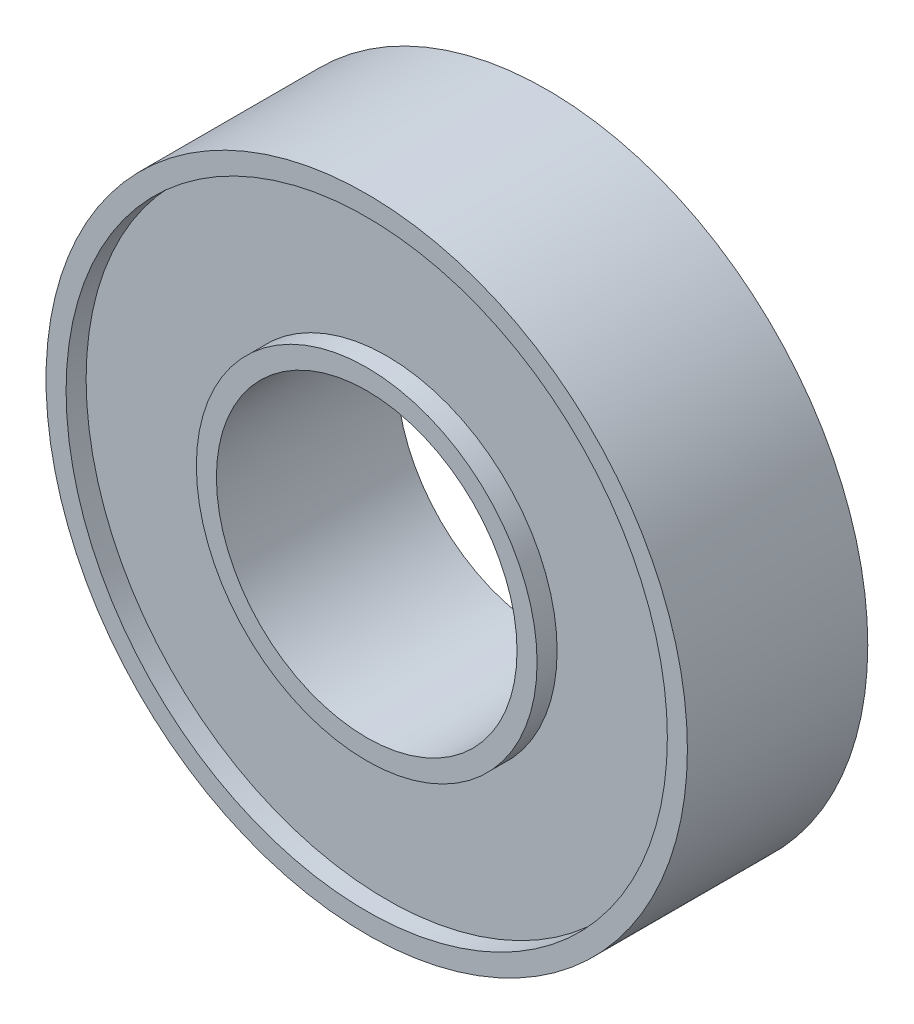
ISO-10303-21;
HEADER;
FILE_DESCRIPTION(('STEP AP214'),'2;1');
FILE_NAME('part.step','',(''),(''),'','','');
FILE_SCHEMA(('AUTOMOTIVE_DESIGN { 1 0 10303 214 1 1 1 1 }'));
ENDSEC;
DATA;
#1=APPLICATION_CONTEXT('core data for automotive mechanical design processes');
#2=APPLICATION_PROTOCOL_DEFINITION('international standard','automotive_design',2000,#1);
#3=PRODUCT_CONTEXT('',#1,'mechanical');
#4=PRODUCT('Part','Part','',(#3));
#5=PRODUCT_RELATED_PRODUCT_CATEGORY('part','',(#4));
#6=PRODUCT_DEFINITION_FORMATION('','',#4);
#7=PRODUCT_DEFINITION_CONTEXT('part definition',#1,'design');
#8=PRODUCT_DEFINITION('design','',#6,#7);
#9=PRODUCT_DEFINITION_SHAPE('','',#8);
#10=(LENGTH_UNIT() NAMED_UNIT(*) SI_UNIT(.MILLI.,.METRE.));
#11=(NAMED_UNIT(*) PLANE_ANGLE_UNIT() SI_UNIT($,.RADIAN.));
#12=(NAMED_UNIT(*) SI_UNIT($,.STERADIAN.) SOLID_ANGLE_UNIT());
#13=UNCERTAINTY_MEASURE_WITH_UNIT(LENGTH_MEASURE(1.E-05),#10,'distance_accuracy_value','');
#14=(GEOMETRIC_REPRESENTATION_CONTEXT(3) GLOBAL_UNCERTAINTY_ASSIGNED_CONTEXT((#13)) GLOBAL_UNIT_ASSIGNED_CONTEXT((#10,
#11,#12)) REPRESENTATION_CONTEXT('',''));
#15=CARTESIAN_POINT('',(0.,0.,0.));
#16=DIRECTION('',(0.,0.,1.));
#17=DIRECTION('',(1.,0.,0.));
#18=AXIS2_PLACEMENT_3D('',#15,#16,#17);
#19=CARTESIAN_POINT('',(0.,0.,12.5289244410984));
#20=DIRECTION('',(0.,0.,1.));
#21=DIRECTION('',(1.,0.,0.));
#22=AXIS2_PLACEMENT_3D('',#19,#20,#21);
#23=CYLINDRICAL_SURFACE('',#22,8.5);
#24=CARTESIAN_POINT('',(0.,0.,4.5));
#25=DIRECTION('',(0.,0.,1.));
#26=DIRECTION('',(1.,0.,0.));
#27=AXIS2_PLACEMENT_3D('',#24,#25,#26);
#28=CIRCLE('',#27,8.49999999999999);
#29=CARTESIAN_POINT('',(8.49999999999999,0.,4.5));
#30=VERTEX_POINT('',#29);
#31=EDGE_CURVE('E10',#30,#30,#28,.T.);
#32=ORIENTED_EDGE('',*,*,#31,.F.);
#33=EDGE_LOOP('',(#32));
#34=FACE_BOUND('',#33,.T.);
#35=CARTESIAN_POINT('',(0.,0.,3.5));
#36=DIRECTION('',(0.,0.,1.));
#37=DIRECTION('',(1.,0.,0.));
#38=AXIS2_PLACEMENT_3D('',#35,#36,#37);
#39=CIRCLE('',#38,8.5);
#40=CARTESIAN_POINT('',(8.5,0.,3.5));
#41=VERTEX_POINT('',#40);
#42=EDGE_CURVE('E88',#41,#41,#39,.T.);
#43=ORIENTED_EDGE('',*,*,#42,.T.);
#44=EDGE_LOOP('',(#43));
#45=FACE_BOUND('',#44,.T.);
#46=ADVANCED_FACE('F37',(#34,#45),#23,.T.);
#47=CARTESIAN_POINT('',(0.,8.49999999999999,4.5));
#48=DIRECTION('',(0.,0.,-1.));
#49=DIRECTION('',(-1.,0.,0.));
#50=AXIS2_PLACEMENT_3D('',#47,#48,#49);
#51=PLANE('',#50);
#52=CARTESIAN_POINT('',(0.,0.,4.5));
#53=DIRECTION('',(0.,0.,1.));
#54=DIRECTION('',(1.,0.,0.));
#55=AXIS2_PLACEMENT_3D('',#52,#53,#54);
#56=CIRCLE('',#55,7.5);
#57=CARTESIAN_POINT('',(7.5,0.,4.5));
#58=VERTEX_POINT('',#57);
#59=EDGE_CURVE('E44',#58,#58,#56,.T.);
#60=ORIENTED_EDGE('',*,*,#59,.F.);
#61=EDGE_LOOP('',(#60));
#62=FACE_BOUND('',#61,.T.);
#63=ORIENTED_EDGE('',*,*,#31,.T.);
#64=EDGE_LOOP('',(#63));
#65=FACE_BOUND('',#64,.T.);
#66=ADVANCED_FACE('F150',(#62,#65),#51,.F.);
#67=CARTESIAN_POINT('',(0.,0.,12.5289244410984));
#68=DIRECTION('',(0.,0.,1.));
#69=DIRECTION('',(1.,0.,0.));
#70=AXIS2_PLACEMENT_3D('',#67,#68,#69);
#71=CYLINDRICAL_SURFACE('',#70,7.5);
#72=CARTESIAN_POINT('',(0.,0.,-4.5));
#73=DIRECTION('',(0.,0.,1.));
#74=DIRECTION('',(1.,0.,0.));
#75=AXIS2_PLACEMENT_3D('',#72,#73,#74);
#76=CIRCLE('',#75,7.5);
#77=CARTESIAN_POINT('',(7.5,0.,-4.5));
#78=VERTEX_POINT('',#77);
#79=EDGE_CURVE('E49',#78,#78,#76,.T.);
#80=ORIENTED_EDGE('',*,*,#79,.F.);
#81=EDGE_LOOP('',(#80));
#82=FACE_BOUND('',#81,.T.);
#83=ORIENTED_EDGE('',*,*,#59,.T.);
#84=EDGE_LOOP('',(#83));
#85=FACE_BOUND('',#84,.T.);
#86=ADVANCED_FACE('F145',(#82,#85),#71,.F.);
#87=CARTESIAN_POINT('',(0.,8.5,-4.5));
#88=DIRECTION('',(0.,0.,1.));
#89=DIRECTION('',(1.,0.,0.));
#90=AXIS2_PLACEMENT_3D('',#87,#88,#89);
#91=PLANE('',#90);
#92=CARTESIAN_POINT('',(0.,0.,-4.5));
#93=DIRECTION('',(0.,0.,1.));
#94=DIRECTION('',(1.,0.,0.));
#95=AXIS2_PLACEMENT_3D('',#92,#93,#94);
#96=CIRCLE('',#95,8.5);
#97=CARTESIAN_POINT('',(8.5,0.,-4.5));
#98=VERTEX_POINT('',#97);
#99=EDGE_CURVE('E54',#98,#98,#96,.T.);
#100=ORIENTED_EDGE('',*,*,#99,.F.);
#101=EDGE_LOOP('',(#100));
#102=FACE_BOUND('',#101,.T.);
#103=ORIENTED_EDGE('',*,*,#79,.T.);
#104=EDGE_LOOP('',(#103));
#105=FACE_BOUND('',#104,.T.);
#106=ADVANCED_FACE('F139',(#102,#105),#91,.F.);
#107=CARTESIAN_POINT('',(0.,0.,12.5289244410984));
#108=DIRECTION('',(0.,0.,1.));
#109=DIRECTION('',(1.,0.,0.));
#110=AXIS2_PLACEMENT_3D('',#107,#108,#109);
#111=CYLINDRICAL_SURFACE('',#110,8.5);
#112=CARTESIAN_POINT('',(0.,0.,-3.5));
#113=DIRECTION('',(0.,0.,1.));
#114=DIRECTION('',(1.,0.,0.));
#115=AXIS2_PLACEMENT_3D('',#112,#113,#114);
#116=CIRCLE('',#115,8.5);
#117=CARTESIAN_POINT('',(8.5,0.,-3.5));
#118=VERTEX_POINT('',#117);
#119=EDGE_CURVE('E60',#118,#118,#116,.T.);
#120=ORIENTED_EDGE('',*,*,#119,.F.);
#121=EDGE_LOOP('',(#120));
#122=FACE_BOUND('',#121,.T.);
#123=ORIENTED_EDGE('',*,*,#99,.T.);
#124=EDGE_LOOP('',(#123));
#125=FACE_BOUND('',#124,.T.);
#126=ADVANCED_FACE('F133',(#122,#125),#111,.T.);
#127=CARTESIAN_POINT('',(0.,15.,-3.5));
#128=DIRECTION('',(0.,0.,1.));
#129=DIRECTION('',(1.,0.,0.));
#130=AXIS2_PLACEMENT_3D('',#127,#128,#129);
#131=PLANE('',#130);
#132=CARTESIAN_POINT('',(0.,0.,-3.5));
#133=DIRECTION('',(0.,0.,1.));
#134=DIRECTION('',(1.,0.,0.));
#135=AXIS2_PLACEMENT_3D('',#132,#133,#134);
#136=CIRCLE('',#135,15.);
#137=CARTESIAN_POINT('',(15.,0.,-3.5));
#138=VERTEX_POINT('',#137);
#139=EDGE_CURVE('E64',#138,#138,#136,.T.);
#140=ORIENTED_EDGE('',*,*,#139,.F.);
#141=EDGE_LOOP('',(#140));
#142=FACE_BOUND('',#141,.T.);
#143=ORIENTED_EDGE('',*,*,#119,.T.);
#144=EDGE_LOOP('',(#143));
#145=FACE_BOUND('',#144,.T.);
#146=ADVANCED_FACE('F127',(#142,#145),#131,.F.);
#147=CARTESIAN_POINT('',(0.,0.,12.5289244410984));
#148=DIRECTION('',(0.,0.,1.));
#149=DIRECTION('',(1.,0.,0.));
#150=AXIS2_PLACEMENT_3D('',#147,#148,#149);
#151=CYLINDRICAL_SURFACE('',#150,15.);
#152=CARTESIAN_POINT('',(0.,0.,-4.5));
#153=DIRECTION('',(0.,0.,1.));
#154=DIRECTION('',(1.,0.,0.));
#155=AXIS2_PLACEMENT_3D('',#152,#153,#154);
#156=CIRCLE('',#155,15.);
#157=CARTESIAN_POINT('',(15.,0.,-4.5));
#158=VERTEX_POINT('',#157);
#159=EDGE_CURVE('E68',#158,#158,#156,.T.);
#160=ORIENTED_EDGE('',*,*,#159,.F.);
#161=EDGE_LOOP('',(#160));
#162=FACE_BOUND('',#161,.T.);
#163=ORIENTED_EDGE('',*,*,#139,.T.);
#164=EDGE_LOOP('',(#163));
#165=FACE_BOUND('',#164,.T.);
#166=ADVANCED_FACE('F121',(#162,#165),#151,.F.);
#167=CARTESIAN_POINT('',(0.,16.,-4.5));
#168=DIRECTION('',(0.,0.,1.));
#169=DIRECTION('',(1.,0.,0.));
#170=AXIS2_PLACEMENT_3D('',#167,#168,#169);
#171=PLANE('',#170);
#172=CARTESIAN_POINT('',(0.,0.,-4.5));
#173=DIRECTION('',(0.,0.,1.));
#174=DIRECTION('',(1.,0.,0.));
#175=AXIS2_PLACEMENT_3D('',#172,#173,#174);
#176=CIRCLE('',#175,16.);
#177=CARTESIAN_POINT('',(16.,0.,-4.5));
#178=VERTEX_POINT('',#177);
#179=EDGE_CURVE('E72',#178,#178,#176,.T.);
#180=ORIENTED_EDGE('',*,*,#179,.F.);
#181=EDGE_LOOP('',(#180));
#182=FACE_BOUND('',#181,.T.);
#183=ORIENTED_EDGE('',*,*,#159,.T.);
#184=EDGE_LOOP('',(#183));
#185=FACE_BOUND('',#184,.T.);
#186=ADVANCED_FACE('F115',(#182,#185),#171,.F.);
#187=CARTESIAN_POINT('',(0.,0.,12.5289244410984));
#188=DIRECTION('',(0.,0.,1.));
#189=DIRECTION('',(1.,0.,0.));
#190=AXIS2_PLACEMENT_3D('',#187,#188,#189);
#191=CYLINDRICAL_SURFACE('',#190,16.);
#192=CARTESIAN_POINT('',(0.,0.,4.5));
#193=DIRECTION('',(0.,0.,1.));
#194=DIRECTION('',(1.,0.,0.));
#195=AXIS2_PLACEMENT_3D('',#192,#193,#194);
#196=CIRCLE('',#195,16.);
#197=CARTESIAN_POINT('',(16.,0.,4.5));
#198=VERTEX_POINT('',#197);
#199=EDGE_CURVE('E76',#198,#198,#196,.T.);
#200=ORIENTED_EDGE('',*,*,#199,.F.);
#201=EDGE_LOOP('',(#200));
#202=FACE_BOUND('',#201,.T.);
#203=ORIENTED_EDGE('',*,*,#179,.T.);
#204=EDGE_LOOP('',(#203));
#205=FACE_BOUND('',#204,.T.);
#206=ADVANCED_FACE('F109',(#202,#205),#191,.T.);
#207=CARTESIAN_POINT('',(0.,16.,4.5));
#208=DIRECTION('',(0.,0.,-1.));
#209=DIRECTION('',(-1.,0.,0.));
#210=AXIS2_PLACEMENT_3D('',#207,#208,#209);
#211=PLANE('',#210);
#212=CARTESIAN_POINT('',(0.,0.,4.5));
#213=DIRECTION('',(0.,0.,1.));
#214=DIRECTION('',(1.,0.,0.));
#215=AXIS2_PLACEMENT_3D('',#212,#213,#214);
#216=CIRCLE('',#215,15.);
#217=CARTESIAN_POINT('',(15.,0.,4.5));
#218=VERTEX_POINT('',#217);
#219=EDGE_CURVE('E80',#218,#218,#216,.T.);
#220=ORIENTED_EDGE('',*,*,#219,.F.);
#221=EDGE_LOOP('',(#220));
#222=FACE_BOUND('',#221,.T.);
#223=ORIENTED_EDGE('',*,*,#199,.T.);
#224=EDGE_LOOP('',(#223));
#225=FACE_BOUND('',#224,.T.);
#226=ADVANCED_FACE('F103',(#222,#225),#211,.F.);
#227=CARTESIAN_POINT('',(0.,0.,12.5289244410984));
#228=DIRECTION('',(0.,0.,1.));
#229=DIRECTION('',(1.,0.,0.));
#230=AXIS2_PLACEMENT_3D('',#227,#228,#229);
#231=CYLINDRICAL_SURFACE('',#230,15.);
#232=CARTESIAN_POINT('',(0.,0.,3.5));
#233=DIRECTION('',(0.,0.,1.));
#234=DIRECTION('',(1.,0.,0.));
#235=AXIS2_PLACEMENT_3D('',#232,#233,#234);
#236=CIRCLE('',#235,15.);
#237=CARTESIAN_POINT('',(15.,0.,3.5));
#238=VERTEX_POINT('',#237);
#239=EDGE_CURVE('E84',#238,#238,#236,.T.);
#240=ORIENTED_EDGE('',*,*,#239,.F.);
#241=EDGE_LOOP('',(#240));
#242=FACE_BOUND('',#241,.T.);
#243=ORIENTED_EDGE('',*,*,#219,.T.);
#244=EDGE_LOOP('',(#243));
#245=FACE_BOUND('',#244,.T.);
#246=ADVANCED_FACE('F97',(#242,#245),#231,.F.);
#247=CARTESIAN_POINT('',(0.,15.,3.5));
#248=DIRECTION('',(0.,0.,-1.));
#249=DIRECTION('',(-1.,0.,0.));
#250=AXIS2_PLACEMENT_3D('',#247,#248,#249);
#251=PLANE('',#250);
#252=ORIENTED_EDGE('',*,*,#42,.F.);
#253=EDGE_LOOP('',(#252));
#254=FACE_BOUND('',#253,.T.);
#255=ORIENTED_EDGE('',*,*,#239,.T.);
#256=EDGE_LOOP('',(#255));
#257=FACE_BOUND('',#256,.T.);
#258=ADVANCED_FACE('F94',(#254,#257),#251,.F.);
#259=CLOSED_SHELL('',(#46,#66,#86,#106,#126,#146,#166,#186,#206,#226,#246,#258));
#260=MANIFOLD_SOLID_BREP('B2',#259);
#261=ADVANCED_BREP_SHAPE_REPRESENTATION('',(#18,#260),#14);
#262=SHAPE_DEFINITION_REPRESENTATION(#9,#261);
ENDSEC;
END-ISO-10303-21;
